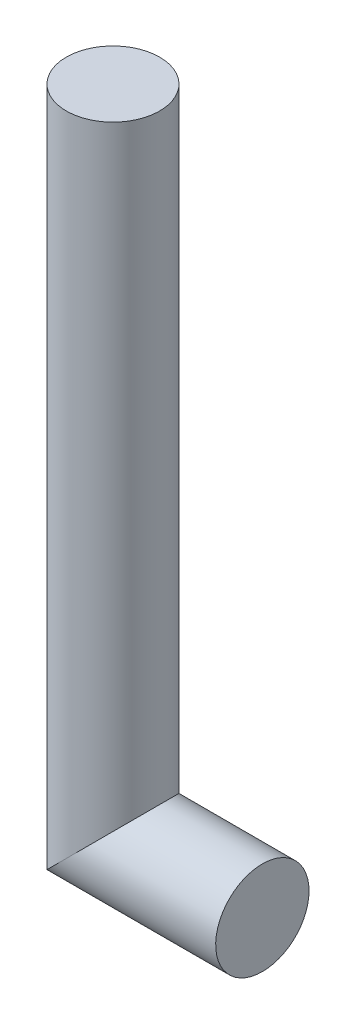
ISO-10303-21;
HEADER;
FILE_DESCRIPTION(('STEP AP214'),'2;1');
FILE_NAME('part.step','',(''),(''),'','','');
FILE_SCHEMA(('AUTOMOTIVE_DESIGN { 1 0 10303 214 1 1 1 1 }'));
ENDSEC;
DATA;
#1=APPLICATION_CONTEXT('core data for automotive mechanical design processes');
#2=APPLICATION_PROTOCOL_DEFINITION('international standard','automotive_design',2000,#1);
#3=PRODUCT_CONTEXT('',#1,'mechanical');
#4=PRODUCT('Part','Part','',(#3));
#5=PRODUCT_RELATED_PRODUCT_CATEGORY('part','',(#4));
#6=PRODUCT_DEFINITION_FORMATION('','',#4);
#7=PRODUCT_DEFINITION_CONTEXT('part definition',#1,'design');
#8=PRODUCT_DEFINITION('design','',#6,#7);
#9=PRODUCT_DEFINITION_SHAPE('','',#8);
#10=(LENGTH_UNIT() NAMED_UNIT(*) SI_UNIT(.MILLI.,.METRE.));
#11=(NAMED_UNIT(*) PLANE_ANGLE_UNIT() SI_UNIT($,.RADIAN.));
#12=(NAMED_UNIT(*) SI_UNIT($,.STERADIAN.) SOLID_ANGLE_UNIT());
#13=UNCERTAINTY_MEASURE_WITH_UNIT(LENGTH_MEASURE(1.E-05),#10,'distance_accuracy_value','');
#14=(GEOMETRIC_REPRESENTATION_CONTEXT(3) GLOBAL_UNCERTAINTY_ASSIGNED_CONTEXT((#13)) GLOBAL_UNIT_ASSIGNED_CONTEXT((#10,
#11,#12)) REPRESENTATION_CONTEXT('',''));
#15=CARTESIAN_POINT('',(0.,0.,0.));
#16=DIRECTION('',(0.,0.,1.));
#17=DIRECTION('',(1.,0.,0.));
#18=AXIS2_PLACEMENT_3D('',#15,#16,#17);
#19=CARTESIAN_POINT('',(0.,520.,0.));
#20=DIRECTION('',(0.,-1.,0.));
#21=DIRECTION('',(0.,0.,-1.));
#22=AXIS2_PLACEMENT_3D('',#19,#20,#21);
#23=PLANE('',#22);
#24=CARTESIAN_POINT('',(0.,520.,0.));
#25=DIRECTION('',(0.,-1.,0.));
#26=DIRECTION('',(0.,0.,-1.));
#27=AXIS2_PLACEMENT_3D('',#24,#25,#26);
#28=CIRCLE('',#27,37.5);
#29=CARTESIAN_POINT('',(0.,520.,-37.5));
#30=VERTEX_POINT('',#29);
#31=EDGE_CURVE('E47',#30,#30,#28,.T.);
#32=ORIENTED_EDGE('',*,*,#31,.F.);
#33=EDGE_LOOP('',(#32));
#34=FACE_BOUND('',#33,.T.);
#35=ADVANCED_FACE('F44',(#34),#23,.F.);
#36=CARTESIAN_POINT('',(120.,0.,0.));
#37=DIRECTION('',(1.,0.,0.));
#38=DIRECTION('',(0.,0.,-1.));
#39=AXIS2_PLACEMENT_3D('',#36,#37,#38);
#40=PLANE('',#39);
#41=CARTESIAN_POINT('',(120.,0.,0.));
#42=DIRECTION('',(1.,0.,0.));
#43=DIRECTION('',(0.,0.,-1.));
#44=AXIS2_PLACEMENT_3D('',#41,#42,#43);
#45=CIRCLE('',#44,37.5);
#46=CARTESIAN_POINT('',(120.,0.,-37.5));
#47=VERTEX_POINT('',#46);
#48=EDGE_CURVE('E51',#47,#47,#45,.T.);
#49=ORIENTED_EDGE('',*,*,#48,.T.);
#50=EDGE_LOOP('',(#49));
#51=FACE_BOUND('',#50,.T.);
#52=ADVANCED_FACE('F64',(#51),#40,.T.);
#53=CARTESIAN_POINT('',(0.,-82.6,0.));
#54=DIRECTION('',(0.,1.,0.));
#55=DIRECTION('',(0.,0.,1.));
#56=AXIS2_PLACEMENT_3D('',#53,#54,#55);
#57=CYLINDRICAL_SURFACE('',#56,37.5);
#58=CARTESIAN_POINT('',(0.,0.,0.));
#59=DIRECTION('',(-0.707106781186548,0.707106781186547,0.));
#60=DIRECTION('',(-0.707106781186547,-0.707106781186548,0.));
#61=AXIS2_PLACEMENT_3D('',#58,#59,#60);
#62=ELLIPSE('',#61,53.0330085889911,37.5);
#63=CARTESIAN_POINT('',(-37.5,-37.5,0.));
#64=VERTEX_POINT('',#63);
#65=EDGE_CURVE('E12',#64,#64,#62,.T.);
#66=ORIENTED_EDGE('',*,*,#65,.T.);
#67=EDGE_LOOP('',(#66));
#68=FACE_BOUND('',#67,.T.);
#69=ORIENTED_EDGE('',*,*,#31,.T.);
#70=EDGE_LOOP('',(#69));
#71=FACE_BOUND('',#70,.T.);
#72=ADVANCED_FACE('F61',(#68,#71),#57,.T.);
#73=CARTESIAN_POINT('',(120.,0.,0.));
#74=DIRECTION('',(-1.,0.,0.));
#75=DIRECTION('',(0.,-1.,0.));
#76=AXIS2_PLACEMENT_3D('',#73,#74,#75);
#77=CYLINDRICAL_SURFACE('',#76,37.5);
#78=ORIENTED_EDGE('',*,*,#48,.F.);
#79=EDGE_LOOP('',(#78));
#80=FACE_BOUND('',#79,.T.);
#81=ORIENTED_EDGE('',*,*,#65,.F.);
#82=EDGE_LOOP('',(#81));
#83=FACE_BOUND('',#82,.T.);
#84=ADVANCED_FACE('F68',(#80,#83),#77,.T.);
#85=CLOSED_SHELL('',(#35,#52,#72,#84));
#86=MANIFOLD_SOLID_BREP('B2',#85);
#87=ADVANCED_BREP_SHAPE_REPRESENTATION('',(#18,#86),#14);
#88=SHAPE_DEFINITION_REPRESENTATION(#9,#87);
ENDSEC;
END-ISO-10303-21;
